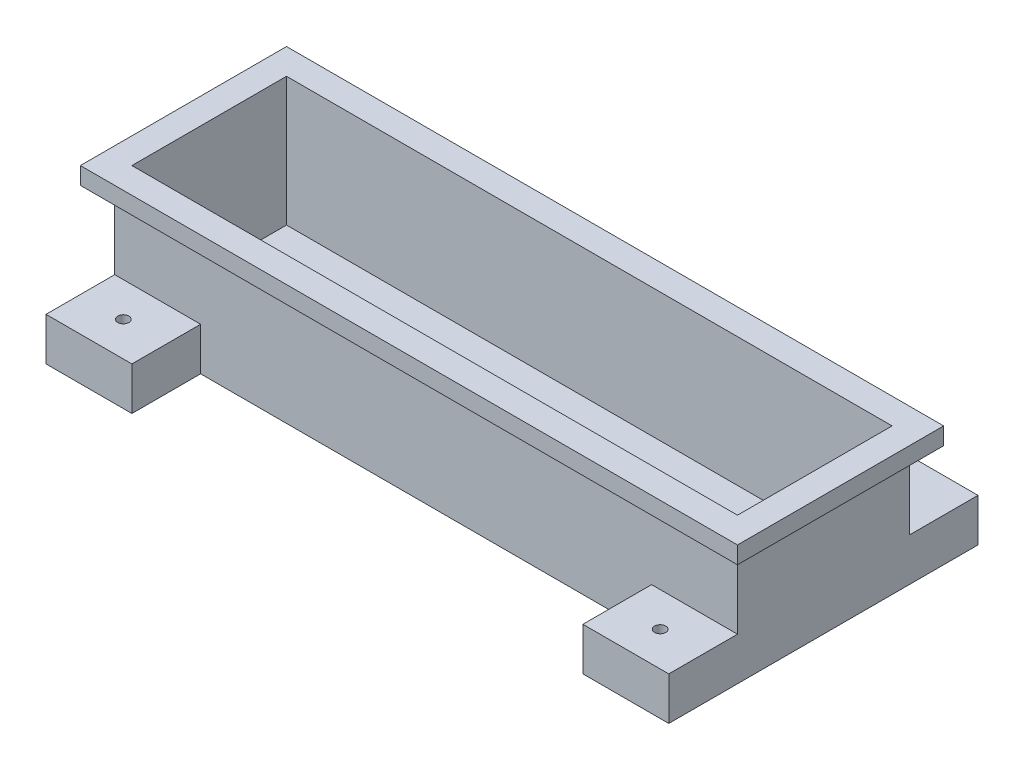
ISO-10303-21;
HEADER;
FILE_DESCRIPTION(('STEP AP214'),'2;1');
FILE_NAME('part.step','',(''),(''),'','','');
FILE_SCHEMA(('AUTOMOTIVE_DESIGN { 1 0 10303 214 1 1 1 1 }'));
ENDSEC;
DATA;
#1=APPLICATION_CONTEXT('core data for automotive mechanical design processes');
#2=APPLICATION_PROTOCOL_DEFINITION('international standard','automotive_design',2000,#1);
#3=PRODUCT_CONTEXT('',#1,'mechanical');
#4=PRODUCT('Part','Part','',(#3));
#5=PRODUCT_RELATED_PRODUCT_CATEGORY('part','',(#4));
#6=PRODUCT_DEFINITION_FORMATION('','',#4);
#7=PRODUCT_DEFINITION_CONTEXT('part definition',#1,'design');
#8=PRODUCT_DEFINITION('design','',#6,#7);
#9=PRODUCT_DEFINITION_SHAPE('','',#8);
#10=(LENGTH_UNIT() NAMED_UNIT(*) SI_UNIT(.MILLI.,.METRE.));
#11=(NAMED_UNIT(*) PLANE_ANGLE_UNIT() SI_UNIT($,.RADIAN.));
#12=(NAMED_UNIT(*) SI_UNIT($,.STERADIAN.) SOLID_ANGLE_UNIT());
#13=UNCERTAINTY_MEASURE_WITH_UNIT(LENGTH_MEASURE(1.E-05),#10,'distance_accuracy_value','');
#14=(GEOMETRIC_REPRESENTATION_CONTEXT(3) GLOBAL_UNCERTAINTY_ASSIGNED_CONTEXT((#13)) GLOBAL_UNIT_ASSIGNED_CONTEXT((#10,
#11,#12)) REPRESENTATION_CONTEXT('',''));
#15=CARTESIAN_POINT('',(0.,0.,0.));
#16=DIRECTION('',(0.,0.,1.));
#17=DIRECTION('',(1.,0.,0.));
#18=AXIS2_PLACEMENT_3D('',#15,#16,#17);
#19=CARTESIAN_POINT('',(0.,30.,0.));
#20=DIRECTION('',(0.,1.,0.));
#21=DIRECTION('',(0.,0.,1.));
#22=AXIS2_PLACEMENT_3D('',#19,#20,#21);
#23=PLANE('',#22);
#24=DIRECTION('',(0.,0.,1.));
#25=VECTOR('',#24,1.);
#26=CARTESIAN_POINT('',(-70.5,30.,-18.));
#27=LINE('',#26,#25);
#28=CARTESIAN_POINT('',(-70.5,30.,-18.));
#29=VERTEX_POINT('',#28);
#30=CARTESIAN_POINT('',(-70.5,30.,18.));
#31=VERTEX_POINT('',#30);
#32=EDGE_CURVE('E444',#29,#31,#27,.T.);
#33=ORIENTED_EDGE('',*,*,#32,.F.);
#34=DIRECTION('',(-1.,0.,0.));
#35=VECTOR('',#34,1.);
#36=CARTESIAN_POINT('',(-70.5,30.,-18.));
#37=LINE('',#36,#35);
#38=CARTESIAN_POINT('',(70.5,30.,-18.));
#39=VERTEX_POINT('',#38);
#40=EDGE_CURVE('E441',#39,#29,#37,.T.);
#41=ORIENTED_EDGE('',*,*,#40,.F.);
#42=DIRECTION('',(0.,0.,-1.));
#43=VECTOR('',#42,1.);
#44=CARTESIAN_POINT('',(70.5,30.,-18.));
#45=LINE('',#44,#43);
#46=CARTESIAN_POINT('',(70.5,30.,18.));
#47=VERTEX_POINT('',#46);
#48=EDGE_CURVE('E452',#47,#39,#45,.T.);
#49=ORIENTED_EDGE('',*,*,#48,.F.);
#50=DIRECTION('',(1.,0.,0.));
#51=VECTOR('',#50,1.);
#52=CARTESIAN_POINT('',(-70.5,30.,18.));
#53=LINE('',#52,#51);
#54=EDGE_CURVE('E448',#31,#47,#53,.T.);
#55=ORIENTED_EDGE('',*,*,#54,.F.);
#56=EDGE_LOOP('',(#33,#41,#49,#55));
#57=FACE_BOUND('',#56,.T.);
#58=DIRECTION('',(-1.,0.,0.));
#59=VECTOR('',#58,1.);
#60=CARTESIAN_POINT('',(76.5,30.,-24.));
#61=LINE('',#60,#59);
#62=CARTESIAN_POINT('',(76.5,30.,-24.));
#63=VERTEX_POINT('',#62);
#64=CARTESIAN_POINT('',(-76.5,30.,-24.));
#65=VERTEX_POINT('',#64);
#66=EDGE_CURVE('E407',#63,#65,#61,.T.);
#67=ORIENTED_EDGE('',*,*,#66,.T.);
#68=DIRECTION('',(0.,0.,1.));
#69=VECTOR('',#68,1.);
#70=CARTESIAN_POINT('',(-76.5,30.,-24.));
#71=LINE('',#70,#69);
#72=CARTESIAN_POINT('',(-76.5,30.,24.));
#73=VERTEX_POINT('',#72);
#74=EDGE_CURVE('E411',#65,#73,#71,.T.);
#75=ORIENTED_EDGE('',*,*,#74,.T.);
#76=DIRECTION('',(1.,0.,0.));
#77=VECTOR('',#76,1.);
#78=CARTESIAN_POINT('',(-76.5,30.,24.));
#79=LINE('',#78,#77);
#80=CARTESIAN_POINT('',(76.5,30.,24.));
#81=VERTEX_POINT('',#80);
#82=EDGE_CURVE('E415',#73,#81,#79,.T.);
#83=ORIENTED_EDGE('',*,*,#82,.T.);
#84=DIRECTION('',(0.,0.,-1.));
#85=VECTOR('',#84,1.);
#86=CARTESIAN_POINT('',(76.5,30.,24.));
#87=LINE('',#86,#85);
#88=EDGE_CURVE('E394',#81,#63,#87,.T.);
#89=ORIENTED_EDGE('',*,*,#88,.T.);
#90=EDGE_LOOP('',(#67,#75,#83,#89));
#91=FACE_BOUND('',#90,.T.);
#92=ADVANCED_FACE('F49',(#57,#91),#23,.T.);
#93=CARTESIAN_POINT('',(-70.5,30.,-18.));
#94=DIRECTION('',(0.,0.,1.));
#95=DIRECTION('',(1.,0.,0.));
#96=AXIS2_PLACEMENT_3D('',#93,#94,#95);
#97=PLANE('',#96);
#98=DIRECTION('',(-1.,0.,0.));
#99=VECTOR('',#98,1.);
#100=CARTESIAN_POINT('',(-70.5,0.,-18.));
#101=LINE('',#100,#99);
#102=CARTESIAN_POINT('',(70.5,0.,-18.));
#103=VERTEX_POINT('',#102);
#104=CARTESIAN_POINT('',(-70.5,0.,-18.));
#105=VERTEX_POINT('',#104);
#106=EDGE_CURVE('E225',#103,#105,#101,.T.);
#107=ORIENTED_EDGE('',*,*,#106,.F.);
#108=DIRECTION('',(0.,-1.,0.));
#109=VECTOR('',#108,1.);
#110=CARTESIAN_POINT('',(70.5,30.,-18.));
#111=LINE('',#110,#109);
#112=EDGE_CURVE('E455',#39,#103,#111,.T.);
#113=ORIENTED_EDGE('',*,*,#112,.F.);
#114=ORIENTED_EDGE('',*,*,#40,.T.);
#115=DIRECTION('',(0.,-1.,0.));
#116=VECTOR('',#115,1.);
#117=CARTESIAN_POINT('',(-70.5,30.,-18.));
#118=LINE('',#117,#116);
#119=EDGE_CURVE('E478',#29,#105,#118,.T.);
#120=ORIENTED_EDGE('',*,*,#119,.T.);
#121=EDGE_LOOP('',(#107,#113,#114,#120));
#122=FACE_BOUND('',#121,.T.);
#123=ADVANCED_FACE('F571',(#122),#97,.T.);
#124=CARTESIAN_POINT('',(-70.5,30.,-18.));
#125=DIRECTION('',(1.,0.,0.));
#126=DIRECTION('',(0.,0.,-1.));
#127=AXIS2_PLACEMENT_3D('',#124,#125,#126);
#128=PLANE('',#127);
#129=DIRECTION('',(0.,0.,1.));
#130=VECTOR('',#129,1.);
#131=CARTESIAN_POINT('',(-70.5,0.,-18.));
#132=LINE('',#131,#130);
#133=CARTESIAN_POINT('',(-70.5,0.,18.));
#134=VERTEX_POINT('',#133);
#135=EDGE_CURVE('E459',#105,#134,#132,.T.);
#136=ORIENTED_EDGE('',*,*,#135,.F.);
#137=ORIENTED_EDGE('',*,*,#119,.F.);
#138=ORIENTED_EDGE('',*,*,#32,.T.);
#139=DIRECTION('',(0.,-1.,0.));
#140=VECTOR('',#139,1.);
#141=CARTESIAN_POINT('',(-70.5,30.,18.));
#142=LINE('',#141,#140);
#143=EDGE_CURVE('E475',#31,#134,#142,.T.);
#144=ORIENTED_EDGE('',*,*,#143,.T.);
#145=EDGE_LOOP('',(#136,#137,#138,#144));
#146=FACE_BOUND('',#145,.T.);
#147=ADVANCED_FACE('F579',(#146),#128,.T.);
#148=CARTESIAN_POINT('',(-70.5,30.,18.));
#149=DIRECTION('',(0.,0.,-1.));
#150=DIRECTION('',(-1.,0.,0.));
#151=AXIS2_PLACEMENT_3D('',#148,#149,#150);
#152=PLANE('',#151);
#153=DIRECTION('',(1.,0.,0.));
#154=VECTOR('',#153,1.);
#155=CARTESIAN_POINT('',(-70.5,0.,18.));
#156=LINE('',#155,#154);
#157=CARTESIAN_POINT('',(70.5,0.,18.));
#158=VERTEX_POINT('',#157);
#159=EDGE_CURVE('E463',#134,#158,#156,.T.);
#160=ORIENTED_EDGE('',*,*,#159,.F.);
#161=ORIENTED_EDGE('',*,*,#143,.F.);
#162=ORIENTED_EDGE('',*,*,#54,.T.);
#163=DIRECTION('',(0.,-1.,0.));
#164=VECTOR('',#163,1.);
#165=CARTESIAN_POINT('',(70.5,30.,18.));
#166=LINE('',#165,#164);
#167=EDGE_CURVE('E472',#47,#158,#166,.T.);
#168=ORIENTED_EDGE('',*,*,#167,.T.);
#169=EDGE_LOOP('',(#160,#161,#162,#168));
#170=FACE_BOUND('',#169,.T.);
#171=ADVANCED_FACE('F674',(#170),#152,.T.);
#172=CARTESIAN_POINT('',(70.5,30.,-18.));
#173=DIRECTION('',(-1.,0.,0.));
#174=DIRECTION('',(0.,0.,1.));
#175=AXIS2_PLACEMENT_3D('',#172,#173,#174);
#176=PLANE('',#175);
#177=DIRECTION('',(0.,0.,-1.));
#178=VECTOR('',#177,1.);
#179=CARTESIAN_POINT('',(70.5,0.,-18.));
#180=LINE('',#179,#178);
#181=EDGE_CURVE('E445',#158,#103,#180,.T.);
#182=ORIENTED_EDGE('',*,*,#181,.F.);
#183=ORIENTED_EDGE('',*,*,#167,.F.);
#184=ORIENTED_EDGE('',*,*,#48,.T.);
#185=ORIENTED_EDGE('',*,*,#112,.T.);
#186=EDGE_LOOP('',(#182,#183,#184,#185));
#187=FACE_BOUND('',#186,.T.);
#188=ADVANCED_FACE('F661',(#187),#176,.T.);
#189=CARTESIAN_POINT('',(0.,0.,0.));
#190=DIRECTION('',(0.,-1.,0.));
#191=DIRECTION('',(0.,0.,-1.));
#192=AXIS2_PLACEMENT_3D('',#189,#190,#191);
#193=PLANE('',#192);
#194=ORIENTED_EDGE('',*,*,#181,.T.);
#195=ORIENTED_EDGE('',*,*,#106,.T.);
#196=ORIENTED_EDGE('',*,*,#135,.T.);
#197=ORIENTED_EDGE('',*,*,#159,.T.);
#198=EDGE_LOOP('',(#194,#195,#196,#197));
#199=FACE_BOUND('',#198,.T.);
#200=ADVANCED_FACE('F642',(#199),#193,.F.);
#201=CARTESIAN_POINT('',(76.5,26.,-24.));
#202=DIRECTION('',(0.,0.,-1.));
#203=DIRECTION('',(-1.,0.,0.));
#204=AXIS2_PLACEMENT_3D('',#201,#202,#203);
#205=PLANE('',#204);
#206=ORIENTED_EDGE('',*,*,#66,.F.);
#207=DIRECTION('',(0.,1.,0.));
#208=VECTOR('',#207,1.);
#209=CARTESIAN_POINT('',(76.5,26.,-24.));
#210=LINE('',#209,#208);
#211=CARTESIAN_POINT('',(76.5,26.,-24.));
#212=VERTEX_POINT('',#211);
#213=EDGE_CURVE('E422',#212,#63,#210,.T.);
#214=ORIENTED_EDGE('',*,*,#213,.F.);
#215=DIRECTION('',(-1.,0.,0.));
#216=VECTOR('',#215,1.);
#217=CARTESIAN_POINT('',(76.5,26.,-24.));
#218=LINE('',#217,#216);
#219=CARTESIAN_POINT('',(-76.5,26.,-24.));
#220=VERTEX_POINT('',#219);
#221=EDGE_CURVE('E389',#212,#220,#218,.T.);
#222=ORIENTED_EDGE('',*,*,#221,.T.);
#223=DIRECTION('',(0.,1.,0.));
#224=VECTOR('',#223,1.);
#225=CARTESIAN_POINT('',(-76.5,26.,-24.));
#226=LINE('',#225,#224);
#227=EDGE_CURVE('E406',#220,#65,#226,.T.);
#228=ORIENTED_EDGE('',*,*,#227,.T.);
#229=EDGE_LOOP('',(#206,#214,#222,#228));
#230=FACE_BOUND('',#229,.T.);
#231=ADVANCED_FACE('F636',(#230),#205,.T.);
#232=CARTESIAN_POINT('',(76.5,26.,24.));
#233=DIRECTION('',(1.,0.,0.));
#234=DIRECTION('',(0.,0.,-1.));
#235=AXIS2_PLACEMENT_3D('',#232,#233,#234);
#236=PLANE('',#235);
#237=ORIENTED_EDGE('',*,*,#88,.F.);
#238=DIRECTION('',(0.,1.,0.));
#239=VECTOR('',#238,1.);
#240=CARTESIAN_POINT('',(76.5,26.,24.));
#241=LINE('',#240,#239);
#242=CARTESIAN_POINT('',(76.5,26.,24.));
#243=VERTEX_POINT('',#242);
#244=EDGE_CURVE('E426',#243,#81,#241,.T.);
#245=ORIENTED_EDGE('',*,*,#244,.F.);
#246=DIRECTION('',(0.,0.,-1.));
#247=VECTOR('',#246,1.);
#248=CARTESIAN_POINT('',(76.5,26.,24.));
#249=LINE('',#248,#247);
#250=EDGE_CURVE('E402',#243,#212,#249,.T.);
#251=ORIENTED_EDGE('',*,*,#250,.T.);
#252=ORIENTED_EDGE('',*,*,#213,.T.);
#253=EDGE_LOOP('',(#237,#245,#251,#252));
#254=FACE_BOUND('',#253,.T.);
#255=ADVANCED_FACE('F629',(#254),#236,.T.);
#256=CARTESIAN_POINT('',(-76.5,26.,24.));
#257=DIRECTION('',(0.,0.,1.));
#258=DIRECTION('',(1.,0.,0.));
#259=AXIS2_PLACEMENT_3D('',#256,#257,#258);
#260=PLANE('',#259);
#261=ORIENTED_EDGE('',*,*,#82,.F.);
#262=DIRECTION('',(0.,1.,0.));
#263=VECTOR('',#262,1.);
#264=CARTESIAN_POINT('',(-76.5,26.,24.));
#265=LINE('',#264,#263);
#266=CARTESIAN_POINT('',(-76.5,26.,24.));
#267=VERTEX_POINT('',#266);
#268=EDGE_CURVE('E429',#267,#73,#265,.T.);
#269=ORIENTED_EDGE('',*,*,#268,.F.);
#270=DIRECTION('',(1.,0.,0.));
#271=VECTOR('',#270,1.);
#272=CARTESIAN_POINT('',(-76.5,26.,24.));
#273=LINE('',#272,#271);
#274=EDGE_CURVE('E398',#267,#243,#273,.T.);
#275=ORIENTED_EDGE('',*,*,#274,.T.);
#276=ORIENTED_EDGE('',*,*,#244,.T.);
#277=EDGE_LOOP('',(#261,#269,#275,#276));
#278=FACE_BOUND('',#277,.T.);
#279=ADVANCED_FACE('F621',(#278),#260,.T.);
#280=CARTESIAN_POINT('',(-76.5,26.,-24.));
#281=DIRECTION('',(-1.,0.,0.));
#282=DIRECTION('',(0.,0.,1.));
#283=AXIS2_PLACEMENT_3D('',#280,#281,#282);
#284=PLANE('',#283);
#285=ORIENTED_EDGE('',*,*,#74,.F.);
#286=ORIENTED_EDGE('',*,*,#227,.F.);
#287=DIRECTION('',(0.,0.,1.));
#288=VECTOR('',#287,1.);
#289=CARTESIAN_POINT('',(-76.5,26.,-24.));
#290=LINE('',#289,#288);
#291=EDGE_CURVE('E393',#220,#267,#290,.T.);
#292=ORIENTED_EDGE('',*,*,#291,.T.);
#293=ORIENTED_EDGE('',*,*,#268,.T.);
#294=EDGE_LOOP('',(#285,#286,#292,#293));
#295=FACE_BOUND('',#294,.T.);
#296=ADVANCED_FACE('F618',(#295),#284,.T.);
#297=CARTESIAN_POINT('',(0.,-2.,0.));
#298=DIRECTION('',(0.,-1.,0.));
#299=DIRECTION('',(0.,0.,-1.));
#300=AXIS2_PLACEMENT_3D('',#297,#298,#299);
#301=PLANE('',#300);
#302=DIRECTION('',(0.,0.,1.));
#303=VECTOR('',#302,1.);
#304=CARTESIAN_POINT('',(72.5,-2.,-20.));
#305=LINE('',#304,#303);
#306=CARTESIAN_POINT('',(72.4999999999999,-2.,-36.));
#307=VERTEX_POINT('',#306);
#308=CARTESIAN_POINT('',(72.5,-2.,36.));
#309=VERTEX_POINT('',#308);
#310=EDGE_CURVE('E211',#307,#309,#305,.T.);
#311=ORIENTED_EDGE('',*,*,#310,.T.);
#312=DIRECTION('',(-1.,0.,0.));
#313=VECTOR('',#312,1.);
#314=CARTESIAN_POINT('',(72.5,-2.,36.));
#315=LINE('',#314,#313);
#316=CARTESIAN_POINT('',(52.5,-2.,36.));
#317=VERTEX_POINT('',#316);
#318=EDGE_CURVE('E322',#309,#317,#315,.T.);
#319=ORIENTED_EDGE('',*,*,#318,.T.);
#320=DIRECTION('',(0.,0.,-1.));
#321=VECTOR('',#320,1.);
#322=CARTESIAN_POINT('',(52.5,-2.,20.));
#323=LINE('',#322,#321);
#324=CARTESIAN_POINT('',(52.5,-2.,20.));
#325=VERTEX_POINT('',#324);
#326=EDGE_CURVE('E319',#317,#325,#323,.T.);
#327=ORIENTED_EDGE('',*,*,#326,.T.);
#328=DIRECTION('',(-1.,0.,0.));
#329=VECTOR('',#328,1.);
#330=CARTESIAN_POINT('',(72.5,-2.,20.));
#331=LINE('',#330,#329);
#332=CARTESIAN_POINT('',(-52.5,-2.,20.));
#333=VERTEX_POINT('',#332);
#334=EDGE_CURVE('E425',#325,#333,#331,.T.);
#335=ORIENTED_EDGE('',*,*,#334,.T.);
#336=DIRECTION('',(0.,0.,1.));
#337=VECTOR('',#336,1.);
#338=CARTESIAN_POINT('',(-52.5,-2.,20.));
#339=LINE('',#338,#337);
#340=CARTESIAN_POINT('',(-52.5,-2.,36.));
#341=VERTEX_POINT('',#340);
#342=EDGE_CURVE('E351',#333,#341,#339,.T.);
#343=ORIENTED_EDGE('',*,*,#342,.T.);
#344=DIRECTION('',(-1.,0.,0.));
#345=VECTOR('',#344,1.);
#346=CARTESIAN_POINT('',(-72.5,-2.,36.));
#347=LINE('',#346,#345);
#348=CARTESIAN_POINT('',(-72.5,-2.,36.));
#349=VERTEX_POINT('',#348);
#350=EDGE_CURVE('E360',#341,#349,#347,.T.);
#351=ORIENTED_EDGE('',*,*,#350,.T.);
#352=DIRECTION('',(0.,0.,-1.));
#353=VECTOR('',#352,1.);
#354=CARTESIAN_POINT('',(-72.5,-2.,20.));
#355=LINE('',#354,#353);
#356=CARTESIAN_POINT('',(-72.4999999999999,-2.,-36.));
#357=VERTEX_POINT('',#356);
#358=EDGE_CURVE('E436',#349,#357,#355,.T.);
#359=ORIENTED_EDGE('',*,*,#358,.T.);
#360=DIRECTION('',(1.,0.,0.));
#361=VECTOR('',#360,1.);
#362=CARTESIAN_POINT('',(-72.4999999999999,-2.,-36.));
#363=LINE('',#362,#361);
#364=CARTESIAN_POINT('',(-52.5,-2.,-36.));
#365=VERTEX_POINT('',#364);
#366=EDGE_CURVE('E283',#357,#365,#363,.T.);
#367=ORIENTED_EDGE('',*,*,#366,.T.);
#368=DIRECTION('',(0.,0.,1.));
#369=VECTOR('',#368,1.);
#370=CARTESIAN_POINT('',(-52.5,-2.,-20.));
#371=LINE('',#370,#369);
#372=CARTESIAN_POINT('',(-52.5,-2.,-20.));
#373=VERTEX_POINT('',#372);
#374=EDGE_CURVE('E279',#365,#373,#371,.T.);
#375=ORIENTED_EDGE('',*,*,#374,.T.);
#376=DIRECTION('',(1.,0.,0.));
#377=VECTOR('',#376,1.);
#378=CARTESIAN_POINT('',(-72.5,-2.,-20.));
#379=LINE('',#378,#377);
#380=CARTESIAN_POINT('',(52.5,-2.,-20.));
#381=VERTEX_POINT('',#380);
#382=EDGE_CURVE('E226',#373,#381,#379,.T.);
#383=ORIENTED_EDGE('',*,*,#382,.T.);
#384=DIRECTION('',(0.,0.,-1.));
#385=VECTOR('',#384,1.);
#386=CARTESIAN_POINT('',(52.5,-2.,-20.));
#387=LINE('',#386,#385);
#388=CARTESIAN_POINT('',(52.5,-2.,-36.));
#389=VERTEX_POINT('',#388);
#390=EDGE_CURVE('E242',#381,#389,#387,.T.);
#391=ORIENTED_EDGE('',*,*,#390,.T.);
#392=DIRECTION('',(1.,0.,0.));
#393=VECTOR('',#392,1.);
#394=CARTESIAN_POINT('',(72.4999999999999,-2.,-36.));
#395=LINE('',#394,#393);
#396=EDGE_CURVE('E231',#389,#307,#395,.T.);
#397=ORIENTED_EDGE('',*,*,#396,.T.);
#398=EDGE_LOOP('',(#311,#319,#327,#335,#343,#351,#359,#367,#375,#383,#391,#397));
#399=FACE_BOUND('',#398,.T.);
#400=CARTESIAN_POINT('',(-62.5,-2.,28.));
#401=DIRECTION('',(0.,-1.,0.));
#402=DIRECTION('',(0.,0.,-1.));
#403=AXIS2_PLACEMENT_3D('',#400,#401,#402);
#404=CIRCLE('',#403,1.3);
#405=CARTESIAN_POINT('',(-62.5,-2.,26.7));
#406=VERTEX_POINT('',#405);
#407=EDGE_CURVE('E343',#406,#406,#404,.T.);
#408=ORIENTED_EDGE('',*,*,#407,.F.);
#409=EDGE_LOOP('',(#408));
#410=FACE_BOUND('',#409,.T.);
#411=CARTESIAN_POINT('',(62.5,-2.,28.));
#412=DIRECTION('',(0.,-1.,0.));
#413=DIRECTION('',(0.,0.,1.));
#414=AXIS2_PLACEMENT_3D('',#411,#412,#413);
#415=CIRCLE('',#414,1.29999999999999);
#416=CARTESIAN_POINT('',(62.5,-2.,29.3));
#417=VERTEX_POINT('',#416);
#418=EDGE_CURVE('E339',#417,#417,#415,.T.);
#419=ORIENTED_EDGE('',*,*,#418,.F.);
#420=EDGE_LOOP('',(#419));
#421=FACE_BOUND('',#420,.T.);
#422=CARTESIAN_POINT('',(-62.5,-2.,-28.));
#423=DIRECTION('',(0.,-1.,0.));
#424=DIRECTION('',(0.,0.,1.));
#425=AXIS2_PLACEMENT_3D('',#422,#423,#424);
#426=CIRCLE('',#425,1.3);
#427=CARTESIAN_POINT('',(-62.5,-2.,-26.7));
#428=VERTEX_POINT('',#427);
#429=EDGE_CURVE('E302',#428,#428,#426,.T.);
#430=ORIENTED_EDGE('',*,*,#429,.F.);
#431=EDGE_LOOP('',(#430));
#432=FACE_BOUND('',#431,.T.);
#433=CARTESIAN_POINT('',(62.5,-2.,-28.));
#434=DIRECTION('',(0.,-1.,0.));
#435=DIRECTION('',(0.,0.,-1.));
#436=AXIS2_PLACEMENT_3D('',#433,#434,#435);
#437=CIRCLE('',#436,1.29999999999999);
#438=CARTESIAN_POINT('',(62.5,-2.,-29.3));
#439=VERTEX_POINT('',#438);
#440=EDGE_CURVE('E261',#439,#439,#437,.T.);
#441=ORIENTED_EDGE('',*,*,#440,.F.);
#442=EDGE_LOOP('',(#441));
#443=FACE_BOUND('',#442,.T.);
#444=ADVANCED_FACE('F239',(#399,#410,#421,#432,#443),#301,.T.);
#445=CARTESIAN_POINT('',(-72.5,30.,-20.));
#446=DIRECTION('',(0.,0.,1.));
#447=DIRECTION('',(1.,0.,0.));
#448=AXIS2_PLACEMENT_3D('',#445,#446,#447);
#449=PLANE('',#448);
#450=DIRECTION('',(-1.,0.,0.));
#451=VECTOR('',#450,1.);
#452=CARTESIAN_POINT('',(72.4999999999999,8.,-20.));
#453=LINE('',#452,#451);
#454=CARTESIAN_POINT('',(72.5,8.,-20.));
#455=VERTEX_POINT('',#454);
#456=CARTESIAN_POINT('',(52.5,8.,-20.));
#457=VERTEX_POINT('',#456);
#458=EDGE_CURVE('E68',#455,#457,#453,.T.);
#459=ORIENTED_EDGE('',*,*,#458,.T.);
#460=DIRECTION('',(0.,-1.,0.));
#461=VECTOR('',#460,1.);
#462=CARTESIAN_POINT('',(52.5,8.,-20.));
#463=LINE('',#462,#461);
#464=EDGE_CURVE('E72',#457,#381,#463,.T.);
#465=ORIENTED_EDGE('',*,*,#464,.T.);
#466=ORIENTED_EDGE('',*,*,#382,.F.);
#467=DIRECTION('',(0.,-1.,0.));
#468=VECTOR('',#467,1.);
#469=CARTESIAN_POINT('',(-52.5,8.,-20.));
#470=LINE('',#469,#468);
#471=CARTESIAN_POINT('',(-52.5,8.,-20.));
#472=VERTEX_POINT('',#471);
#473=EDGE_CURVE('E265',#472,#373,#470,.T.);
#474=ORIENTED_EDGE('',*,*,#473,.F.);
#475=DIRECTION('',(-1.,0.,0.));
#476=VECTOR('',#475,1.);
#477=CARTESIAN_POINT('',(-72.4999999999999,8.,-20.));
#478=LINE('',#477,#476);
#479=CARTESIAN_POINT('',(-72.4999999999999,8.,-20.));
#480=VERTEX_POINT('',#479);
#481=EDGE_CURVE('E273',#472,#480,#478,.T.);
#482=ORIENTED_EDGE('',*,*,#481,.T.);
#483=DIRECTION('',(0.,-1.,0.));
#484=VECTOR('',#483,1.);
#485=CARTESIAN_POINT('',(-72.5,30.,-20.));
#486=LINE('',#485,#484);
#487=CARTESIAN_POINT('',(-72.5,22.,-20.));
#488=VERTEX_POINT('',#487);
#489=EDGE_CURVE('E482',#488,#480,#486,.T.);
#490=ORIENTED_EDGE('',*,*,#489,.F.);
#491=DIRECTION('',(1.,0.,0.));
#492=VECTOR('',#491,1.);
#493=CARTESIAN_POINT('',(72.5,22.,-20.));
#494=LINE('',#493,#492);
#495=CARTESIAN_POINT('',(72.5,22.,-20.));
#496=VERTEX_POINT('',#495);
#497=EDGE_CURVE('E500',#488,#496,#494,.T.);
#498=ORIENTED_EDGE('',*,*,#497,.T.);
#499=DIRECTION('',(0.,-1.,0.));
#500=VECTOR('',#499,1.);
#501=CARTESIAN_POINT('',(72.5,30.,-20.));
#502=LINE('',#501,#500);
#503=EDGE_CURVE('E486',#496,#455,#502,.T.);
#504=ORIENTED_EDGE('',*,*,#503,.T.);
#505=EDGE_LOOP('',(#459,#465,#466,#474,#482,#490,#498,#504));
#506=FACE_BOUND('',#505,.T.);
#507=ADVANCED_FACE('F531',(#506),#449,.F.);
#508=CARTESIAN_POINT('',(72.5,30.,-20.));
#509=DIRECTION('',(-1.,0.,0.));
#510=DIRECTION('',(0.,0.,1.));
#511=AXIS2_PLACEMENT_3D('',#508,#509,#510);
#512=PLANE('',#511);
#513=ORIENTED_EDGE('',*,*,#503,.F.);
#514=DIRECTION('',(0.,0.,1.));
#515=VECTOR('',#514,1.);
#516=CARTESIAN_POINT('',(72.5,22.,20.));
#517=LINE('',#516,#515);
#518=CARTESIAN_POINT('',(72.5,22.,20.));
#519=VERTEX_POINT('',#518);
#520=EDGE_CURVE('E496',#496,#519,#517,.T.);
#521=ORIENTED_EDGE('',*,*,#520,.T.);
#522=DIRECTION('',(0.,-1.,0.));
#523=VECTOR('',#522,1.);
#524=CARTESIAN_POINT('',(72.5,30.,20.));
#525=LINE('',#524,#523);
#526=CARTESIAN_POINT('',(72.5,8.,20.));
#527=VERTEX_POINT('',#526);
#528=EDGE_CURVE('E489',#519,#527,#525,.T.);
#529=ORIENTED_EDGE('',*,*,#528,.T.);
#530=DIRECTION('',(0.,0.,1.));
#531=VECTOR('',#530,1.);
#532=CARTESIAN_POINT('',(72.5,8.,20.));
#533=LINE('',#532,#531);
#534=CARTESIAN_POINT('',(72.5,8.,36.));
#535=VERTEX_POINT('',#534);
#536=EDGE_CURVE('E323',#527,#535,#533,.T.);
#537=ORIENTED_EDGE('',*,*,#536,.T.);
#538=DIRECTION('',(0.,-1.,0.));
#539=VECTOR('',#538,1.);
#540=CARTESIAN_POINT('',(72.5,8.,36.));
#541=LINE('',#540,#539);
#542=EDGE_CURVE('E219',#535,#309,#541,.T.);
#543=ORIENTED_EDGE('',*,*,#542,.T.);
#544=ORIENTED_EDGE('',*,*,#310,.F.);
#545=DIRECTION('',(0.,-1.,0.));
#546=VECTOR('',#545,1.);
#547=CARTESIAN_POINT('',(72.4999999999999,8.,-36.));
#548=LINE('',#547,#546);
#549=CARTESIAN_POINT('',(72.4999999999999,8.,-36.));
#550=VERTEX_POINT('',#549);
#551=EDGE_CURVE('E216',#550,#307,#548,.T.);
#552=ORIENTED_EDGE('',*,*,#551,.F.);
#553=DIRECTION('',(0.,0.,1.));
#554=VECTOR('',#553,1.);
#555=CARTESIAN_POINT('',(72.4999999999999,8.,-20.));
#556=LINE('',#555,#554);
#557=EDGE_CURVE('E253',#550,#455,#556,.T.);
#558=ORIENTED_EDGE('',*,*,#557,.T.);
#559=EDGE_LOOP('',(#513,#521,#529,#537,#543,#544,#552,#558));
#560=FACE_BOUND('',#559,.T.);
#561=ADVANCED_FACE('F214',(#560),#512,.F.);
#562=CARTESIAN_POINT('',(-72.5,30.,20.));
#563=DIRECTION('',(0.,0.,-1.));
#564=DIRECTION('',(-1.,0.,0.));
#565=AXIS2_PLACEMENT_3D('',#562,#563,#564);
#566=PLANE('',#565);
#567=ORIENTED_EDGE('',*,*,#334,.F.);
#568=DIRECTION('',(0.,-1.,0.));
#569=VECTOR('',#568,1.);
#570=CARTESIAN_POINT('',(52.5,8.,20.));
#571=LINE('',#570,#569);
#572=CARTESIAN_POINT('',(52.5,8.,20.));
#573=VERTEX_POINT('',#572);
#574=EDGE_CURVE('E306',#573,#325,#571,.T.);
#575=ORIENTED_EDGE('',*,*,#574,.F.);
#576=DIRECTION('',(1.,0.,0.));
#577=VECTOR('',#576,1.);
#578=CARTESIAN_POINT('',(72.5,8.,20.));
#579=LINE('',#578,#577);
#580=EDGE_CURVE('E312',#573,#527,#579,.T.);
#581=ORIENTED_EDGE('',*,*,#580,.T.);
#582=ORIENTED_EDGE('',*,*,#528,.F.);
#583=DIRECTION('',(-1.,0.,0.));
#584=VECTOR('',#583,1.);
#585=CARTESIAN_POINT('',(-72.5,22.,20.));
#586=LINE('',#585,#584);
#587=CARTESIAN_POINT('',(-72.5,22.,20.));
#588=VERTEX_POINT('',#587);
#589=EDGE_CURVE('E11',#519,#588,#586,.T.);
#590=ORIENTED_EDGE('',*,*,#589,.T.);
#591=DIRECTION('',(0.,-1.,0.));
#592=VECTOR('',#591,1.);
#593=CARTESIAN_POINT('',(-72.5,30.,20.));
#594=LINE('',#593,#592);
#595=CARTESIAN_POINT('',(-72.5,8.,20.));
#596=VERTEX_POINT('',#595);
#597=EDGE_CURVE('E493',#588,#596,#594,.T.);
#598=ORIENTED_EDGE('',*,*,#597,.T.);
#599=DIRECTION('',(1.,0.,0.));
#600=VECTOR('',#599,1.);
#601=CARTESIAN_POINT('',(-72.5,8.,20.));
#602=LINE('',#601,#600);
#603=CARTESIAN_POINT('',(-52.5,8.,20.));
#604=VERTEX_POINT('',#603);
#605=EDGE_CURVE('E359',#596,#604,#602,.T.);
#606=ORIENTED_EDGE('',*,*,#605,.T.);
#607=DIRECTION('',(0.,-1.,0.));
#608=VECTOR('',#607,1.);
#609=CARTESIAN_POINT('',(-52.5,8.,20.));
#610=LINE('',#609,#608);
#611=EDGE_CURVE('E371',#604,#333,#610,.T.);
#612=ORIENTED_EDGE('',*,*,#611,.T.);
#613=EDGE_LOOP('',(#567,#575,#581,#582,#590,#598,#606,#612));
#614=FACE_BOUND('',#613,.T.);
#615=ADVANCED_FACE('F555',(#614),#566,.F.);
#616=CARTESIAN_POINT('',(-72.5,30.,-20.));
#617=DIRECTION('',(1.,0.,0.));
#618=DIRECTION('',(0.,0.,-1.));
#619=AXIS2_PLACEMENT_3D('',#616,#617,#618);
#620=PLANE('',#619);
#621=ORIENTED_EDGE('',*,*,#597,.F.);
#622=DIRECTION('',(0.,0.,-1.));
#623=VECTOR('',#622,1.);
#624=CARTESIAN_POINT('',(-72.5,22.,-20.));
#625=LINE('',#624,#623);
#626=EDGE_CURVE('E60',#588,#488,#625,.T.);
#627=ORIENTED_EDGE('',*,*,#626,.T.);
#628=ORIENTED_EDGE('',*,*,#489,.T.);
#629=DIRECTION('',(0.,0.,-1.));
#630=VECTOR('',#629,1.);
#631=CARTESIAN_POINT('',(-72.4999999999999,8.,-20.));
#632=LINE('',#631,#630);
#633=CARTESIAN_POINT('',(-72.4999999999999,8.,-36.));
#634=VERTEX_POINT('',#633);
#635=EDGE_CURVE('E284',#480,#634,#632,.T.);
#636=ORIENTED_EDGE('',*,*,#635,.T.);
#637=DIRECTION('',(0.,-1.,0.));
#638=VECTOR('',#637,1.);
#639=CARTESIAN_POINT('',(-72.4999999999999,8.,-36.));
#640=LINE('',#639,#638);
#641=EDGE_CURVE('E269',#634,#357,#640,.T.);
#642=ORIENTED_EDGE('',*,*,#641,.T.);
#643=ORIENTED_EDGE('',*,*,#358,.F.);
#644=DIRECTION('',(0.,-1.,0.));
#645=VECTOR('',#644,1.);
#646=CARTESIAN_POINT('',(-72.5,8.,36.));
#647=LINE('',#646,#645);
#648=CARTESIAN_POINT('',(-72.5,8.,36.));
#649=VERTEX_POINT('',#648);
#650=EDGE_CURVE('E378',#649,#349,#647,.T.);
#651=ORIENTED_EDGE('',*,*,#650,.F.);
#652=DIRECTION('',(0.,0.,-1.));
#653=VECTOR('',#652,1.);
#654=CARTESIAN_POINT('',(-72.5,8.,20.));
#655=LINE('',#654,#653);
#656=EDGE_CURVE('E355',#649,#596,#655,.T.);
#657=ORIENTED_EDGE('',*,*,#656,.T.);
#658=EDGE_LOOP('',(#621,#627,#628,#636,#642,#643,#651,#657));
#659=FACE_BOUND('',#658,.T.);
#660=ADVANCED_FACE('F530',(#659),#620,.F.);
#661=CARTESIAN_POINT('',(-76.5,26.,0.));
#662=DIRECTION('',(-0.707106781186544,-0.707106781186551,0.));
#663=DIRECTION('',(0.,0.,-1.));
#664=AXIS2_PLACEMENT_3D('',#661,#662,#663);
#665=PLANE('',#664);
#666=DIRECTION('',(0.577350269189628,-0.577350269189622,0.577350269189628));
#667=VECTOR('',#666,1.);
#668=CARTESIAN_POINT('',(-68.5,18.,-16.));
#669=LINE('',#668,#667);
#670=EDGE_CURVE('E509',#488,#220,#669,.F.);
#671=ORIENTED_EDGE('',*,*,#670,.F.);
#672=ORIENTED_EDGE('',*,*,#626,.F.);
#673=DIRECTION('',(0.577350269189628,-0.577350269189622,-0.577350269189628));
#674=VECTOR('',#673,1.);
#675=CARTESIAN_POINT('',(-50.9999999999998,0.50000000000007,-1.50000000000015));
#676=LINE('',#675,#674);
#677=EDGE_CURVE('E54',#267,#588,#676,.T.);
#678=ORIENTED_EDGE('',*,*,#677,.F.);
#679=ORIENTED_EDGE('',*,*,#291,.F.);
#680=EDGE_LOOP('',(#671,#672,#678,#679));
#681=FACE_BOUND('',#680,.T.);
#682=ADVANCED_FACE('F52',(#681),#665,.T.);
#683=CARTESIAN_POINT('',(0.,26.,24.));
#684=DIRECTION('',(0.,-0.707106781186551,0.707106781186544));
#685=DIRECTION('',(-1.,0.,0.));
#686=AXIS2_PLACEMENT_3D('',#683,#684,#685);
#687=PLANE('',#686);
#688=ORIENTED_EDGE('',*,*,#677,.T.);
#689=ORIENTED_EDGE('',*,*,#589,.F.);
#690=DIRECTION('',(0.577350269189628,0.577350269189622,0.577350269189628));
#691=VECTOR('',#690,1.);
#692=CARTESIAN_POINT('',(50.9999999999999,0.500000000000073,-1.50000000000017));
#693=LINE('',#692,#691);
#694=EDGE_CURVE('E507',#243,#519,#693,.F.);
#695=ORIENTED_EDGE('',*,*,#694,.F.);
#696=ORIENTED_EDGE('',*,*,#274,.F.);
#697=EDGE_LOOP('',(#688,#689,#695,#696));
#698=FACE_BOUND('',#697,.T.);
#699=ADVANCED_FACE('F522',(#698),#687,.T.);
#700=CARTESIAN_POINT('',(0.,26.,-24.));
#701=DIRECTION('',(0.,-0.707106781186551,-0.707106781186544));
#702=DIRECTION('',(1.,0.,0.));
#703=AXIS2_PLACEMENT_3D('',#700,#701,#702);
#704=PLANE('',#703);
#705=ORIENTED_EDGE('',*,*,#670,.T.);
#706=ORIENTED_EDGE('',*,*,#221,.F.);
#707=DIRECTION('',(-0.577350269189628,-0.577350269189622,0.577350269189628));
#708=VECTOR('',#707,1.);
#709=CARTESIAN_POINT('',(50.9999999999999,0.500000000000073,1.50000000000016));
#710=LINE('',#709,#708);
#711=EDGE_CURVE('E382',#496,#212,#710,.F.);
#712=ORIENTED_EDGE('',*,*,#711,.F.);
#713=ORIENTED_EDGE('',*,*,#497,.F.);
#714=EDGE_LOOP('',(#705,#706,#712,#713));
#715=FACE_BOUND('',#714,.T.);
#716=ADVANCED_FACE('F600',(#715),#704,.T.);
#717=CARTESIAN_POINT('',(76.5,26.,0.));
#718=DIRECTION('',(0.707106781186544,-0.707106781186551,0.));
#719=DIRECTION('',(0.,0.,1.));
#720=AXIS2_PLACEMENT_3D('',#717,#718,#719);
#721=PLANE('',#720);
#722=ORIENTED_EDGE('',*,*,#694,.T.);
#723=ORIENTED_EDGE('',*,*,#520,.F.);
#724=ORIENTED_EDGE('',*,*,#711,.T.);
#725=ORIENTED_EDGE('',*,*,#250,.F.);
#726=EDGE_LOOP('',(#722,#723,#724,#725));
#727=FACE_BOUND('',#726,.T.);
#728=ADVANCED_FACE('F567',(#727),#721,.T.);
#729=CARTESIAN_POINT('',(-72.5,8.,36.));
#730=DIRECTION('',(0.,0.,1.));
#731=DIRECTION('',(1.,0.,0.));
#732=AXIS2_PLACEMENT_3D('',#729,#730,#731);
#733=PLANE('',#732);
#734=ORIENTED_EDGE('',*,*,#350,.F.);
#735=DIRECTION('',(0.,-1.,0.));
#736=VECTOR('',#735,1.);
#737=CARTESIAN_POINT('',(-52.5,8.,36.));
#738=LINE('',#737,#736);
#739=CARTESIAN_POINT('',(-52.5,8.,36.));
#740=VERTEX_POINT('',#739);
#741=EDGE_CURVE('E383',#740,#341,#738,.T.);
#742=ORIENTED_EDGE('',*,*,#741,.F.);
#743=DIRECTION('',(-1.,0.,0.));
#744=VECTOR('',#743,1.);
#745=CARTESIAN_POINT('',(-72.5,8.,36.));
#746=LINE('',#745,#744);
#747=EDGE_CURVE('E367',#740,#649,#746,.T.);
#748=ORIENTED_EDGE('',*,*,#747,.T.);
#749=ORIENTED_EDGE('',*,*,#650,.T.);
#750=EDGE_LOOP('',(#734,#742,#748,#749));
#751=FACE_BOUND('',#750,.T.);
#752=ADVANCED_FACE('F545',(#751),#733,.T.);
#753=CARTESIAN_POINT('',(-52.5,8.,20.));
#754=DIRECTION('',(1.,0.,0.));
#755=DIRECTION('',(0.,0.,-1.));
#756=AXIS2_PLACEMENT_3D('',#753,#754,#755);
#757=PLANE('',#756);
#758=ORIENTED_EDGE('',*,*,#342,.F.);
#759=ORIENTED_EDGE('',*,*,#611,.F.);
#760=DIRECTION('',(0.,0.,1.));
#761=VECTOR('',#760,1.);
#762=CARTESIAN_POINT('',(-52.5,8.,20.));
#763=LINE('',#762,#761);
#764=EDGE_CURVE('E363',#604,#740,#763,.T.);
#765=ORIENTED_EDGE('',*,*,#764,.T.);
#766=ORIENTED_EDGE('',*,*,#741,.T.);
#767=EDGE_LOOP('',(#758,#759,#765,#766));
#768=FACE_BOUND('',#767,.T.);
#769=ADVANCED_FACE('F557',(#768),#757,.T.);
#770=CARTESIAN_POINT('',(0.,8.,0.));
#771=DIRECTION('',(0.,1.,0.));
#772=DIRECTION('',(0.,0.,1.));
#773=AXIS2_PLACEMENT_3D('',#770,#771,#772);
#774=PLANE('',#773);
#775=CARTESIAN_POINT('',(-62.5,8.,28.));
#776=DIRECTION('',(0.,-1.,0.));
#777=DIRECTION('',(0.,0.,-1.));
#778=AXIS2_PLACEMENT_3D('',#775,#776,#777);
#779=CIRCLE('',#778,1.3);
#780=CARTESIAN_POINT('',(-62.5,8.,26.7));
#781=VERTEX_POINT('',#780);
#782=EDGE_CURVE('E347',#781,#781,#779,.T.);
#783=ORIENTED_EDGE('',*,*,#782,.T.);
#784=EDGE_LOOP('',(#783));
#785=FACE_BOUND('',#784,.T.);
#786=ORIENTED_EDGE('',*,*,#656,.F.);
#787=ORIENTED_EDGE('',*,*,#747,.F.);
#788=ORIENTED_EDGE('',*,*,#764,.F.);
#789=ORIENTED_EDGE('',*,*,#605,.F.);
#790=EDGE_LOOP('',(#786,#787,#788,#789));
#791=FACE_BOUND('',#790,.T.);
#792=ADVANCED_FACE('F550',(#785,#791),#774,.T.);
#793=CARTESIAN_POINT('',(-62.5,8.,28.));
#794=DIRECTION('',(0.,-1.,0.));
#795=DIRECTION('',(0.,0.,-1.));
#796=AXIS2_PLACEMENT_3D('',#793,#794,#795);
#797=CYLINDRICAL_SURFACE('',#796,1.3);
#798=ORIENTED_EDGE('',*,*,#782,.F.);
#799=EDGE_LOOP('',(#798));
#800=FACE_BOUND('',#799,.T.);
#801=ORIENTED_EDGE('',*,*,#407,.T.);
#802=EDGE_LOOP('',(#801));
#803=FACE_BOUND('',#802,.T.);
#804=ADVANCED_FACE('F564',(#800,#803),#797,.F.);
#805=CARTESIAN_POINT('',(52.5,8.,20.));
#806=DIRECTION('',(-1.,0.,0.));
#807=DIRECTION('',(0.,0.,1.));
#808=AXIS2_PLACEMENT_3D('',#805,#806,#807);
#809=PLANE('',#808);
#810=ORIENTED_EDGE('',*,*,#326,.F.);
#811=DIRECTION('',(0.,-1.,0.));
#812=VECTOR('',#811,1.);
#813=CARTESIAN_POINT('',(52.5,8.,36.));
#814=LINE('',#813,#812);
#815=CARTESIAN_POINT('',(52.5,8.,36.));
#816=VERTEX_POINT('',#815);
#817=EDGE_CURVE('E313',#816,#317,#814,.T.);
#818=ORIENTED_EDGE('',*,*,#817,.F.);
#819=DIRECTION('',(0.,0.,-1.));
#820=VECTOR('',#819,1.);
#821=CARTESIAN_POINT('',(52.5,8.,20.));
#822=LINE('',#821,#820);
#823=EDGE_CURVE('E330',#816,#573,#822,.T.);
#824=ORIENTED_EDGE('',*,*,#823,.T.);
#825=ORIENTED_EDGE('',*,*,#574,.T.);
#826=EDGE_LOOP('',(#810,#818,#824,#825));
#827=FACE_BOUND('',#826,.T.);
#828=ADVANCED_FACE('F815',(#827),#809,.T.);
#829=CARTESIAN_POINT('',(72.5,8.,36.));
#830=DIRECTION('',(0.,0.,1.));
#831=DIRECTION('',(1.,0.,0.));
#832=AXIS2_PLACEMENT_3D('',#829,#830,#831);
#833=PLANE('',#832);
#834=ORIENTED_EDGE('',*,*,#318,.F.);
#835=ORIENTED_EDGE('',*,*,#542,.F.);
#836=DIRECTION('',(-1.,0.,0.));
#837=VECTOR('',#836,1.);
#838=CARTESIAN_POINT('',(72.5,8.,36.));
#839=LINE('',#838,#837);
#840=EDGE_CURVE('E333',#535,#816,#839,.T.);
#841=ORIENTED_EDGE('',*,*,#840,.T.);
#842=ORIENTED_EDGE('',*,*,#817,.T.);
#843=EDGE_LOOP('',(#834,#835,#841,#842));
#844=FACE_BOUND('',#843,.T.);
#845=ADVANCED_FACE('F825',(#844),#833,.T.);
#846=CARTESIAN_POINT('',(0.,8.,0.));
#847=DIRECTION('',(0.,-1.,0.));
#848=DIRECTION('',(0.,0.,-1.));
#849=AXIS2_PLACEMENT_3D('',#846,#847,#848);
#850=PLANE('',#849);
#851=CARTESIAN_POINT('',(62.5,8.,28.));
#852=DIRECTION('',(0.,-1.,0.));
#853=DIRECTION('',(0.,0.,1.));
#854=AXIS2_PLACEMENT_3D('',#851,#852,#853);
#855=CIRCLE('',#854,1.29999999999999);
#856=CARTESIAN_POINT('',(62.5,8.,29.3));
#857=VERTEX_POINT('',#856);
#858=EDGE_CURVE('E326',#857,#857,#855,.T.);
#859=ORIENTED_EDGE('',*,*,#858,.T.);
#860=EDGE_LOOP('',(#859));
#861=FACE_BOUND('',#860,.T.);
#862=ORIENTED_EDGE('',*,*,#536,.F.);
#863=ORIENTED_EDGE('',*,*,#580,.F.);
#864=ORIENTED_EDGE('',*,*,#823,.F.);
#865=ORIENTED_EDGE('',*,*,#840,.F.);
#866=EDGE_LOOP('',(#862,#863,#864,#865));
#867=FACE_BOUND('',#866,.T.);
#868=ADVANCED_FACE('F835',(#861,#867),#850,.F.);
#869=CARTESIAN_POINT('',(62.5,8.,28.));
#870=DIRECTION('',(0.,-1.,0.));
#871=DIRECTION('',(0.,0.,-1.));
#872=AXIS2_PLACEMENT_3D('',#869,#870,#871);
#873=CYLINDRICAL_SURFACE('',#872,1.29999999999999);
#874=ORIENTED_EDGE('',*,*,#858,.F.);
#875=EDGE_LOOP('',(#874));
#876=FACE_BOUND('',#875,.T.);
#877=ORIENTED_EDGE('',*,*,#418,.T.);
#878=EDGE_LOOP('',(#877));
#879=FACE_BOUND('',#878,.T.);
#880=ADVANCED_FACE('F845',(#876,#879),#873,.F.);
#881=CARTESIAN_POINT('',(-52.5,8.,-20.));
#882=DIRECTION('',(1.,0.,0.));
#883=DIRECTION('',(0.,0.,-1.));
#884=AXIS2_PLACEMENT_3D('',#881,#882,#883);
#885=PLANE('',#884);
#886=ORIENTED_EDGE('',*,*,#374,.F.);
#887=DIRECTION('',(0.,-1.,0.));
#888=VECTOR('',#887,1.);
#889=CARTESIAN_POINT('',(-52.5,8.,-36.));
#890=LINE('',#889,#888);
#891=CARTESIAN_POINT('',(-52.5,8.,-36.));
#892=VERTEX_POINT('',#891);
#893=EDGE_CURVE('E274',#892,#365,#890,.T.);
#894=ORIENTED_EDGE('',*,*,#893,.F.);
#895=DIRECTION('',(0.,0.,1.));
#896=VECTOR('',#895,1.);
#897=CARTESIAN_POINT('',(-52.5,8.,-20.));
#898=LINE('',#897,#896);
#899=EDGE_CURVE('E292',#892,#472,#898,.T.);
#900=ORIENTED_EDGE('',*,*,#899,.T.);
#901=ORIENTED_EDGE('',*,*,#473,.T.);
#902=EDGE_LOOP('',(#886,#894,#900,#901));
#903=FACE_BOUND('',#902,.T.);
#904=ADVANCED_FACE('F855',(#903),#885,.T.);
#905=CARTESIAN_POINT('',(-72.4999999999999,8.,-36.));
#906=DIRECTION('',(0.,0.,-1.));
#907=DIRECTION('',(-1.,0.,0.));
#908=AXIS2_PLACEMENT_3D('',#905,#906,#907);
#909=PLANE('',#908);
#910=ORIENTED_EDGE('',*,*,#366,.F.);
#911=ORIENTED_EDGE('',*,*,#641,.F.);
#912=DIRECTION('',(1.,0.,0.));
#913=VECTOR('',#912,1.);
#914=CARTESIAN_POINT('',(-72.4999999999999,8.,-36.));
#915=LINE('',#914,#913);
#916=EDGE_CURVE('E295',#634,#892,#915,.T.);
#917=ORIENTED_EDGE('',*,*,#916,.T.);
#918=ORIENTED_EDGE('',*,*,#893,.T.);
#919=EDGE_LOOP('',(#910,#911,#917,#918));
#920=FACE_BOUND('',#919,.T.);
#921=ADVANCED_FACE('F540',(#920),#909,.T.);
#922=CARTESIAN_POINT('',(0.,8.,0.));
#923=DIRECTION('',(0.,-1.,0.));
#924=DIRECTION('',(0.,0.,-1.));
#925=AXIS2_PLACEMENT_3D('',#922,#923,#924);
#926=PLANE('',#925);
#927=CARTESIAN_POINT('',(-62.5,8.,-28.));
#928=DIRECTION('',(0.,-1.,0.));
#929=DIRECTION('',(0.,0.,1.));
#930=AXIS2_PLACEMENT_3D('',#927,#928,#929);
#931=CIRCLE('',#930,1.3);
#932=CARTESIAN_POINT('',(-62.5,8.,-26.7));
#933=VERTEX_POINT('',#932);
#934=EDGE_CURVE('E288',#933,#933,#931,.T.);
#935=ORIENTED_EDGE('',*,*,#934,.T.);
#936=EDGE_LOOP('',(#935));
#937=FACE_BOUND('',#936,.T.);
#938=ORIENTED_EDGE('',*,*,#635,.F.);
#939=ORIENTED_EDGE('',*,*,#481,.F.);
#940=ORIENTED_EDGE('',*,*,#899,.F.);
#941=ORIENTED_EDGE('',*,*,#916,.F.);
#942=EDGE_LOOP('',(#938,#939,#940,#941));
#943=FACE_BOUND('',#942,.T.);
#944=ADVANCED_FACE('F536',(#937,#943),#926,.F.);
#945=CARTESIAN_POINT('',(-62.5,8.,-28.));
#946=DIRECTION('',(0.,-1.,0.));
#947=DIRECTION('',(0.,0.,-1.));
#948=AXIS2_PLACEMENT_3D('',#945,#946,#947);
#949=CYLINDRICAL_SURFACE('',#948,1.3);
#950=ORIENTED_EDGE('',*,*,#934,.F.);
#951=EDGE_LOOP('',(#950));
#952=FACE_BOUND('',#951,.T.);
#953=ORIENTED_EDGE('',*,*,#429,.T.);
#954=EDGE_LOOP('',(#953));
#955=FACE_BOUND('',#954,.T.);
#956=ADVANCED_FACE('F882',(#952,#955),#949,.F.);
#957=CARTESIAN_POINT('',(72.4999999999999,8.,-36.));
#958=DIRECTION('',(0.,0.,-1.));
#959=DIRECTION('',(-1.,0.,0.));
#960=AXIS2_PLACEMENT_3D('',#957,#958,#959);
#961=PLANE('',#960);
#962=ORIENTED_EDGE('',*,*,#396,.F.);
#963=DIRECTION('',(0.,-1.,0.));
#964=VECTOR('',#963,1.);
#965=CARTESIAN_POINT('',(52.5,8.,-36.));
#966=LINE('',#965,#964);
#967=CARTESIAN_POINT('',(52.5,8.,-36.));
#968=VERTEX_POINT('',#967);
#969=EDGE_CURVE('E237',#968,#389,#966,.T.);
#970=ORIENTED_EDGE('',*,*,#969,.F.);
#971=DIRECTION('',(1.,0.,0.));
#972=VECTOR('',#971,1.);
#973=CARTESIAN_POINT('',(72.4999999999999,8.,-36.));
#974=LINE('',#973,#972);
#975=EDGE_CURVE('E234',#968,#550,#974,.T.);
#976=ORIENTED_EDGE('',*,*,#975,.T.);
#977=ORIENTED_EDGE('',*,*,#551,.T.);
#978=EDGE_LOOP('',(#962,#970,#976,#977));
#979=FACE_BOUND('',#978,.T.);
#980=ADVANCED_FACE('F230',(#979),#961,.T.);
#981=CARTESIAN_POINT('',(52.5,8.,-20.));
#982=DIRECTION('',(-1.,0.,0.));
#983=DIRECTION('',(0.,0.,1.));
#984=AXIS2_PLACEMENT_3D('',#981,#982,#983);
#985=PLANE('',#984);
#986=ORIENTED_EDGE('',*,*,#390,.F.);
#987=ORIENTED_EDGE('',*,*,#464,.F.);
#988=DIRECTION('',(0.,0.,-1.));
#989=VECTOR('',#988,1.);
#990=CARTESIAN_POINT('',(52.5,8.,-20.));
#991=LINE('',#990,#989);
#992=EDGE_CURVE('E249',#457,#968,#991,.T.);
#993=ORIENTED_EDGE('',*,*,#992,.T.);
#994=ORIENTED_EDGE('',*,*,#969,.T.);
#995=EDGE_LOOP('',(#986,#987,#993,#994));
#996=FACE_BOUND('',#995,.T.);
#997=ADVANCED_FACE('F901',(#996),#985,.T.);
#998=CARTESIAN_POINT('',(0.,8.,0.));
#999=DIRECTION('',(0.,-1.,0.));
#1000=DIRECTION('',(0.,0.,-1.));
#1001=AXIS2_PLACEMENT_3D('',#998,#999,#1000);
#1002=PLANE('',#1001);
#1003=CARTESIAN_POINT('',(62.5,8.,-28.));
#1004=DIRECTION('',(0.,-1.,0.));
#1005=DIRECTION('',(0.,0.,-1.));
#1006=AXIS2_PLACEMENT_3D('',#1003,#1004,#1005);
#1007=CIRCLE('',#1006,1.29999999999999);
#1008=CARTESIAN_POINT('',(62.5,8.,-29.3));
#1009=VERTEX_POINT('',#1008);
#1010=EDGE_CURVE('E247',#1009,#1009,#1007,.T.);
#1011=ORIENTED_EDGE('',*,*,#1010,.T.);
#1012=EDGE_LOOP('',(#1011));
#1013=FACE_BOUND('',#1012,.T.);
#1014=ORIENTED_EDGE('',*,*,#458,.F.);
#1015=ORIENTED_EDGE('',*,*,#557,.F.);
#1016=ORIENTED_EDGE('',*,*,#975,.F.);
#1017=ORIENTED_EDGE('',*,*,#992,.F.);
#1018=EDGE_LOOP('',(#1014,#1015,#1016,#1017));
#1019=FACE_BOUND('',#1018,.T.);
#1020=ADVANCED_FACE('F910',(#1013,#1019),#1002,.F.);
#1021=CARTESIAN_POINT('',(62.5,8.,-28.));
#1022=DIRECTION('',(0.,-1.,0.));
#1023=DIRECTION('',(0.,0.,-1.));
#1024=AXIS2_PLACEMENT_3D('',#1021,#1022,#1023);
#1025=CYLINDRICAL_SURFACE('',#1024,1.29999999999999);
#1026=ORIENTED_EDGE('',*,*,#1010,.F.);
#1027=EDGE_LOOP('',(#1026));
#1028=FACE_BOUND('',#1027,.T.);
#1029=ORIENTED_EDGE('',*,*,#440,.T.);
#1030=EDGE_LOOP('',(#1029));
#1031=FACE_BOUND('',#1030,.T.);
#1032=ADVANCED_FACE('F920',(#1028,#1031),#1025,.F.);
#1033=CLOSED_SHELL('',(#92,#123,#147,#171,#188,#200,#231,#255,#279,#296,#444,#507,#561,#615,
#660,#682,#699,#716,#728,#752,#769,#792,#804,#828,#845,#868,#880,#904,#921,#944,#956,#980,#997,
#1020,#1032));
#1034=MANIFOLD_SOLID_BREP('B2',#1033);
#1035=ADVANCED_BREP_SHAPE_REPRESENTATION('',(#18,#1034),#14);
#1036=SHAPE_DEFINITION_REPRESENTATION(#9,#1035);
ENDSEC;
END-ISO-10303-21;
